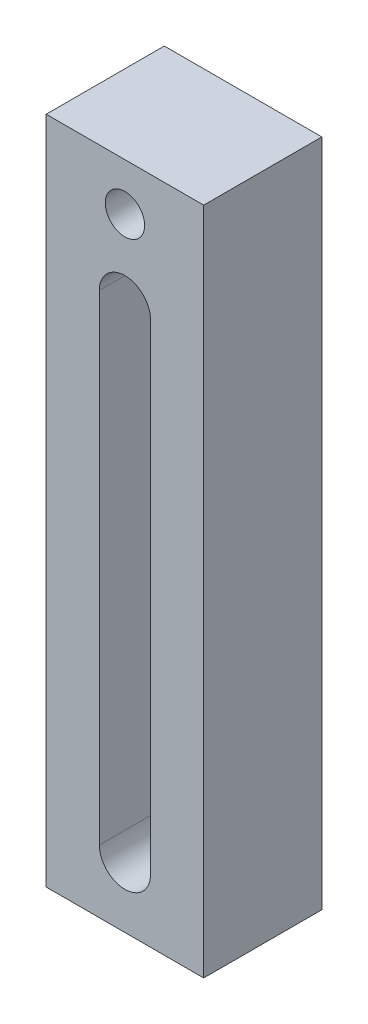
ISO-10303-21;
HEADER;
FILE_DESCRIPTION(('STEP AP214'),'2;1');
FILE_NAME('part.step','',(''),(''),'','','');
FILE_SCHEMA(('AUTOMOTIVE_DESIGN { 1 0 10303 214 1 1 1 1 }'));
ENDSEC;
DATA;
#1=APPLICATION_CONTEXT('core data for automotive mechanical design processes');
#2=APPLICATION_PROTOCOL_DEFINITION('international standard','automotive_design',2000,#1);
#3=PRODUCT_CONTEXT('',#1,'mechanical');
#4=PRODUCT('Part','Part','',(#3));
#5=PRODUCT_RELATED_PRODUCT_CATEGORY('part','',(#4));
#6=PRODUCT_DEFINITION_FORMATION('','',#4);
#7=PRODUCT_DEFINITION_CONTEXT('part definition',#1,'design');
#8=PRODUCT_DEFINITION('design','',#6,#7);
#9=PRODUCT_DEFINITION_SHAPE('','',#8);
#10=(LENGTH_UNIT() NAMED_UNIT(*) SI_UNIT(.MILLI.,.METRE.));
#11=(NAMED_UNIT(*) PLANE_ANGLE_UNIT() SI_UNIT($,.RADIAN.));
#12=(NAMED_UNIT(*) SI_UNIT($,.STERADIAN.) SOLID_ANGLE_UNIT());
#13=UNCERTAINTY_MEASURE_WITH_UNIT(LENGTH_MEASURE(1.E-05),#10,'distance_accuracy_value','');
#14=(GEOMETRIC_REPRESENTATION_CONTEXT(3) GLOBAL_UNCERTAINTY_ASSIGNED_CONTEXT((#13)) GLOBAL_UNIT_ASSIGNED_CONTEXT((#10,
#11,#12)) REPRESENTATION_CONTEXT('',''));
#15=CARTESIAN_POINT('',(0.,0.,0.));
#16=DIRECTION('',(0.,0.,1.));
#17=DIRECTION('',(1.,0.,0.));
#18=AXIS2_PLACEMENT_3D('',#15,#16,#17);
#19=CARTESIAN_POINT('',(0.,0.,15.));
#20=DIRECTION('',(1.,0.,0.));
#21=DIRECTION('',(0.,0.,-1.));
#22=AXIS2_PLACEMENT_3D('',#19,#20,#21);
#23=PLANE('',#22);
#24=DIRECTION('',(0.,-1.,0.));
#25=VECTOR('',#24,1.);
#26=CARTESIAN_POINT('',(0.,0.,0.));
#27=LINE('',#26,#25);
#28=CARTESIAN_POINT('',(0.,85.,0.));
#29=VERTEX_POINT('',#28);
#30=CARTESIAN_POINT('',(0.,0.,0.));
#31=VERTEX_POINT('',#30);
#32=EDGE_CURVE('E133',#29,#31,#27,.T.);
#33=ORIENTED_EDGE('',*,*,#32,.T.);
#34=DIRECTION('',(0.,0.,-1.));
#35=VECTOR('',#34,1.);
#36=CARTESIAN_POINT('',(0.,0.,15.));
#37=LINE('',#36,#35);
#38=CARTESIAN_POINT('',(0.,0.,15.));
#39=VERTEX_POINT('',#38);
#40=EDGE_CURVE('E11',#39,#31,#37,.T.);
#41=ORIENTED_EDGE('',*,*,#40,.F.);
#42=DIRECTION('',(0.,-1.,0.));
#43=VECTOR('',#42,1.);
#44=CARTESIAN_POINT('',(0.,0.,15.));
#45=LINE('',#44,#43);
#46=CARTESIAN_POINT('',(0.,85.,15.));
#47=VERTEX_POINT('',#46);
#48=EDGE_CURVE('E137',#47,#39,#45,.T.);
#49=ORIENTED_EDGE('',*,*,#48,.F.);
#50=DIRECTION('',(0.,0.,-1.));
#51=VECTOR('',#50,1.);
#52=CARTESIAN_POINT('',(0.,85.,15.));
#53=LINE('',#52,#51);
#54=EDGE_CURVE('E147',#47,#29,#53,.T.);
#55=ORIENTED_EDGE('',*,*,#54,.T.);
#56=EDGE_LOOP('',(#33,#41,#49,#55));
#57=FACE_BOUND('',#56,.T.);
#58=ADVANCED_FACE('F32',(#57),#23,.F.);
#59=CARTESIAN_POINT('',(0.,0.,15.));
#60=DIRECTION('',(0.,1.,0.));
#61=DIRECTION('',(0.,0.,1.));
#62=AXIS2_PLACEMENT_3D('',#59,#60,#61);
#63=PLANE('',#62);
#64=DIRECTION('',(1.,0.,0.));
#65=VECTOR('',#64,1.);
#66=CARTESIAN_POINT('',(0.,0.,0.));
#67=LINE('',#66,#65);
#68=CARTESIAN_POINT('',(20.,0.,0.));
#69=VERTEX_POINT('',#68);
#70=EDGE_CURVE('E150',#31,#69,#67,.T.);
#71=ORIENTED_EDGE('',*,*,#70,.T.);
#72=DIRECTION('',(0.,0.,-1.));
#73=VECTOR('',#72,1.);
#74=CARTESIAN_POINT('',(20.,0.,15.));
#75=LINE('',#74,#73);
#76=CARTESIAN_POINT('',(20.,0.,15.));
#77=VERTEX_POINT('',#76);
#78=EDGE_CURVE('E39',#77,#69,#75,.T.);
#79=ORIENTED_EDGE('',*,*,#78,.F.);
#80=DIRECTION('',(1.,0.,0.));
#81=VECTOR('',#80,1.);
#82=CARTESIAN_POINT('',(0.,0.,15.));
#83=LINE('',#82,#81);
#84=EDGE_CURVE('E140',#39,#77,#83,.T.);
#85=ORIENTED_EDGE('',*,*,#84,.F.);
#86=ORIENTED_EDGE('',*,*,#40,.T.);
#87=EDGE_LOOP('',(#71,#79,#85,#86));
#88=FACE_BOUND('',#87,.T.);
#89=ADVANCED_FACE('F178',(#88),#63,.F.);
#90=CARTESIAN_POINT('',(20.,0.,15.));
#91=DIRECTION('',(-1.,0.,0.));
#92=DIRECTION('',(0.,0.,1.));
#93=AXIS2_PLACEMENT_3D('',#90,#91,#92);
#94=PLANE('',#93);
#95=DIRECTION('',(0.,1.,0.));
#96=VECTOR('',#95,1.);
#97=CARTESIAN_POINT('',(20.,0.,0.));
#98=LINE('',#97,#96);
#99=CARTESIAN_POINT('',(20.,85.,0.));
#100=VERTEX_POINT('',#99);
#101=EDGE_CURVE('E152',#69,#100,#98,.T.);
#102=ORIENTED_EDGE('',*,*,#101,.T.);
#103=DIRECTION('',(0.,0.,-1.));
#104=VECTOR('',#103,1.);
#105=CARTESIAN_POINT('',(20.,85.,15.));
#106=LINE('',#105,#104);
#107=CARTESIAN_POINT('',(20.,85.,15.));
#108=VERTEX_POINT('',#107);
#109=EDGE_CURVE('E157',#108,#100,#106,.T.);
#110=ORIENTED_EDGE('',*,*,#109,.F.);
#111=DIRECTION('',(0.,1.,0.));
#112=VECTOR('',#111,1.);
#113=CARTESIAN_POINT('',(20.,0.,15.));
#114=LINE('',#113,#112);
#115=EDGE_CURVE('E143',#77,#108,#114,.T.);
#116=ORIENTED_EDGE('',*,*,#115,.F.);
#117=ORIENTED_EDGE('',*,*,#78,.T.);
#118=EDGE_LOOP('',(#102,#110,#116,#117));
#119=FACE_BOUND('',#118,.T.);
#120=ADVANCED_FACE('F164',(#119),#94,.F.);
#121=CARTESIAN_POINT('',(0.,85.,15.));
#122=DIRECTION('',(0.,-1.,0.));
#123=DIRECTION('',(0.,0.,-1.));
#124=AXIS2_PLACEMENT_3D('',#121,#122,#123);
#125=PLANE('',#124);
#126=DIRECTION('',(-1.,0.,0.));
#127=VECTOR('',#126,1.);
#128=CARTESIAN_POINT('',(0.,85.,0.));
#129=LINE('',#128,#127);
#130=EDGE_CURVE('E141',#100,#29,#129,.T.);
#131=ORIENTED_EDGE('',*,*,#130,.T.);
#132=ORIENTED_EDGE('',*,*,#54,.F.);
#133=DIRECTION('',(-1.,0.,0.));
#134=VECTOR('',#133,1.);
#135=CARTESIAN_POINT('',(0.,85.,15.));
#136=LINE('',#135,#134);
#137=EDGE_CURVE('E145',#108,#47,#136,.T.);
#138=ORIENTED_EDGE('',*,*,#137,.F.);
#139=ORIENTED_EDGE('',*,*,#109,.T.);
#140=EDGE_LOOP('',(#131,#132,#138,#139));
#141=FACE_BOUND('',#140,.T.);
#142=ADVANCED_FACE('F171',(#141),#125,.F.);
#143=CARTESIAN_POINT('',(0.,0.,15.));
#144=DIRECTION('',(0.,0.,-1.));
#145=DIRECTION('',(-1.,0.,0.));
#146=AXIS2_PLACEMENT_3D('',#143,#144,#145);
#147=PLANE('',#146);
#148=CARTESIAN_POINT('',(10.,79.,15.));
#149=DIRECTION('',(0.,0.,1.));
#150=DIRECTION('',(1.,0.,0.));
#151=AXIS2_PLACEMENT_3D('',#148,#149,#150);
#152=CIRCLE('',#151,2.5);
#153=CARTESIAN_POINT('',(12.5,79.,15.));
#154=VERTEX_POINT('',#153);
#155=EDGE_CURVE('E120',#154,#154,#152,.T.);
#156=ORIENTED_EDGE('',*,*,#155,.F.);
#157=EDGE_LOOP('',(#156));
#158=FACE_BOUND('',#157,.T.);
#159=DIRECTION('',(0.,1.,0.));
#160=VECTOR('',#159,1.);
#161=CARTESIAN_POINT('',(13.25,8.,15.));
#162=LINE('',#161,#160);
#163=CARTESIAN_POINT('',(13.25,8.,15.));
#164=VERTEX_POINT('',#163);
#165=CARTESIAN_POINT('',(13.25,69.,15.));
#166=VERTEX_POINT('',#165);
#167=EDGE_CURVE('E126',#164,#166,#162,.T.);
#168=ORIENTED_EDGE('',*,*,#167,.F.);
#169=CARTESIAN_POINT('',(10.,8.,15.));
#170=DIRECTION('',(0.,0.,1.));
#171=DIRECTION('',(1.,0.,0.));
#172=AXIS2_PLACEMENT_3D('',#169,#170,#171);
#173=CIRCLE('',#172,3.25);
#174=CARTESIAN_POINT('',(6.75,8.,15.));
#175=VERTEX_POINT('',#174);
#176=EDGE_CURVE('E46',#175,#164,#173,.T.);
#177=ORIENTED_EDGE('',*,*,#176,.F.);
#178=DIRECTION('',(0.,-1.,0.));
#179=VECTOR('',#178,1.);
#180=CARTESIAN_POINT('',(6.75,8.,15.));
#181=LINE('',#180,#179);
#182=CARTESIAN_POINT('',(6.75,69.,15.));
#183=VERTEX_POINT('',#182);
#184=EDGE_CURVE('E114',#183,#175,#181,.T.);
#185=ORIENTED_EDGE('',*,*,#184,.F.);
#186=CARTESIAN_POINT('',(10.,69.,15.));
#187=DIRECTION('',(0.,0.,1.));
#188=DIRECTION('',(1.,0.,0.));
#189=AXIS2_PLACEMENT_3D('',#186,#187,#188);
#190=CIRCLE('',#189,3.25);
#191=EDGE_CURVE('E117',#166,#183,#190,.T.);
#192=ORIENTED_EDGE('',*,*,#191,.F.);
#193=EDGE_LOOP('',(#168,#177,#185,#192));
#194=FACE_BOUND('',#193,.T.);
#195=ORIENTED_EDGE('',*,*,#48,.T.);
#196=ORIENTED_EDGE('',*,*,#84,.T.);
#197=ORIENTED_EDGE('',*,*,#115,.T.);
#198=ORIENTED_EDGE('',*,*,#137,.T.);
#199=EDGE_LOOP('',(#195,#196,#197,#198));
#200=FACE_BOUND('',#199,.T.);
#201=ADVANCED_FACE('F177',(#158,#194,#200),#147,.F.);
#202=CARTESIAN_POINT('',(0.,0.,0.));
#203=DIRECTION('',(0.,0.,-1.));
#204=DIRECTION('',(-1.,0.,0.));
#205=AXIS2_PLACEMENT_3D('',#202,#203,#204);
#206=PLANE('',#205);
#207=CARTESIAN_POINT('',(10.,79.,0.));
#208=DIRECTION('',(0.,0.,1.));
#209=DIRECTION('',(1.,0.,0.));
#210=AXIS2_PLACEMENT_3D('',#207,#208,#209);
#211=CIRCLE('',#210,2.5);
#212=CARTESIAN_POINT('',(12.5,79.,0.));
#213=VERTEX_POINT('',#212);
#214=EDGE_CURVE('E127',#213,#213,#211,.T.);
#215=ORIENTED_EDGE('',*,*,#214,.T.);
#216=EDGE_LOOP('',(#215));
#217=FACE_BOUND('',#216,.T.);
#218=CARTESIAN_POINT('',(10.,8.,0.));
#219=DIRECTION('',(0.,0.,1.));
#220=DIRECTION('',(1.,0.,0.));
#221=AXIS2_PLACEMENT_3D('',#218,#219,#220);
#222=CIRCLE('',#221,3.25);
#223=CARTESIAN_POINT('',(6.75,8.,0.));
#224=VERTEX_POINT('',#223);
#225=CARTESIAN_POINT('',(13.25,8.,0.));
#226=VERTEX_POINT('',#225);
#227=EDGE_CURVE('E98',#224,#226,#222,.T.);
#228=ORIENTED_EDGE('',*,*,#227,.T.);
#229=DIRECTION('',(0.,1.,0.));
#230=VECTOR('',#229,1.);
#231=CARTESIAN_POINT('',(13.25,8.,0.));
#232=LINE('',#231,#230);
#233=CARTESIAN_POINT('',(13.25,69.,0.));
#234=VERTEX_POINT('',#233);
#235=EDGE_CURVE('E107',#226,#234,#232,.T.);
#236=ORIENTED_EDGE('',*,*,#235,.T.);
#237=CARTESIAN_POINT('',(10.,69.,0.));
#238=DIRECTION('',(0.,0.,1.));
#239=DIRECTION('',(1.,0.,0.));
#240=AXIS2_PLACEMENT_3D('',#237,#238,#239);
#241=CIRCLE('',#240,3.25);
#242=CARTESIAN_POINT('',(6.75,69.,0.));
#243=VERTEX_POINT('',#242);
#244=EDGE_CURVE('E54',#234,#243,#241,.T.);
#245=ORIENTED_EDGE('',*,*,#244,.T.);
#246=DIRECTION('',(0.,-1.,0.));
#247=VECTOR('',#246,1.);
#248=CARTESIAN_POINT('',(6.75,8.,0.));
#249=LINE('',#248,#247);
#250=EDGE_CURVE('E104',#243,#224,#249,.T.);
#251=ORIENTED_EDGE('',*,*,#250,.T.);
#252=EDGE_LOOP('',(#228,#236,#245,#251));
#253=FACE_BOUND('',#252,.T.);
#254=ORIENTED_EDGE('',*,*,#32,.F.);
#255=ORIENTED_EDGE('',*,*,#130,.F.);
#256=ORIENTED_EDGE('',*,*,#101,.F.);
#257=ORIENTED_EDGE('',*,*,#70,.F.);
#258=EDGE_LOOP('',(#254,#255,#256,#257));
#259=FACE_BOUND('',#258,.T.);
#260=ADVANCED_FACE('F111',(#217,#253,#259),#206,.T.);
#261=CARTESIAN_POINT('',(10.,8.,0.));
#262=DIRECTION('',(0.,0.,1.));
#263=DIRECTION('',(1.,0.,0.));
#264=AXIS2_PLACEMENT_3D('',#261,#262,#263);
#265=CYLINDRICAL_SURFACE('',#264,3.25);
#266=ORIENTED_EDGE('',*,*,#176,.T.);
#267=DIRECTION('',(0.,0.,1.));
#268=VECTOR('',#267,1.);
#269=CARTESIAN_POINT('',(13.25,8.,0.));
#270=LINE('',#269,#268);
#271=EDGE_CURVE('E94',#226,#164,#270,.T.);
#272=ORIENTED_EDGE('',*,*,#271,.F.);
#273=ORIENTED_EDGE('',*,*,#227,.F.);
#274=DIRECTION('',(0.,0.,1.));
#275=VECTOR('',#274,1.);
#276=CARTESIAN_POINT('',(6.75,8.,0.));
#277=LINE('',#276,#275);
#278=EDGE_CURVE('E131',#224,#175,#277,.T.);
#279=ORIENTED_EDGE('',*,*,#278,.T.);
#280=EDGE_LOOP('',(#266,#272,#273,#279));
#281=FACE_BOUND('',#280,.T.);
#282=ADVANCED_FACE('F96',(#281),#265,.F.);
#283=CARTESIAN_POINT('',(6.75,8.,0.));
#284=DIRECTION('',(-1.,0.,0.));
#285=DIRECTION('',(0.,0.,1.));
#286=AXIS2_PLACEMENT_3D('',#283,#284,#285);
#287=PLANE('',#286);
#288=ORIENTED_EDGE('',*,*,#184,.T.);
#289=ORIENTED_EDGE('',*,*,#278,.F.);
#290=ORIENTED_EDGE('',*,*,#250,.F.);
#291=DIRECTION('',(0.,0.,1.));
#292=VECTOR('',#291,1.);
#293=CARTESIAN_POINT('',(6.75,69.,0.));
#294=LINE('',#293,#292);
#295=EDGE_CURVE('E134',#243,#183,#294,.T.);
#296=ORIENTED_EDGE('',*,*,#295,.T.);
#297=EDGE_LOOP('',(#288,#289,#290,#296));
#298=FACE_BOUND('',#297,.T.);
#299=ADVANCED_FACE('F196',(#298),#287,.F.);
#300=CARTESIAN_POINT('',(10.,69.,0.));
#301=DIRECTION('',(0.,0.,1.));
#302=DIRECTION('',(1.,0.,0.));
#303=AXIS2_PLACEMENT_3D('',#300,#301,#302);
#304=CYLINDRICAL_SURFACE('',#303,3.25);
#305=ORIENTED_EDGE('',*,*,#191,.T.);
#306=ORIENTED_EDGE('',*,*,#295,.F.);
#307=ORIENTED_EDGE('',*,*,#244,.F.);
#308=DIRECTION('',(0.,0.,1.));
#309=VECTOR('',#308,1.);
#310=CARTESIAN_POINT('',(13.25,69.,0.));
#311=LINE('',#310,#309);
#312=EDGE_CURVE('E103',#234,#166,#311,.T.);
#313=ORIENTED_EDGE('',*,*,#312,.T.);
#314=EDGE_LOOP('',(#305,#306,#307,#313));
#315=FACE_BOUND('',#314,.T.);
#316=ADVANCED_FACE('F200',(#315),#304,.F.);
#317=CARTESIAN_POINT('',(13.25,8.,0.));
#318=DIRECTION('',(1.,0.,0.));
#319=DIRECTION('',(0.,0.,-1.));
#320=AXIS2_PLACEMENT_3D('',#317,#318,#319);
#321=PLANE('',#320);
#322=ORIENTED_EDGE('',*,*,#167,.T.);
#323=ORIENTED_EDGE('',*,*,#312,.F.);
#324=ORIENTED_EDGE('',*,*,#235,.F.);
#325=ORIENTED_EDGE('',*,*,#271,.T.);
#326=EDGE_LOOP('',(#322,#323,#324,#325));
#327=FACE_BOUND('',#326,.T.);
#328=ADVANCED_FACE('F108',(#327),#321,.F.);
#329=CARTESIAN_POINT('',(10.,79.,0.));
#330=DIRECTION('',(0.,0.,1.));
#331=DIRECTION('',(1.,0.,0.));
#332=AXIS2_PLACEMENT_3D('',#329,#330,#331);
#333=CYLINDRICAL_SURFACE('',#332,2.5);
#334=ORIENTED_EDGE('',*,*,#214,.F.);
#335=EDGE_LOOP('',(#334));
#336=FACE_BOUND('',#335,.T.);
#337=ORIENTED_EDGE('',*,*,#155,.T.);
#338=EDGE_LOOP('',(#337));
#339=FACE_BOUND('',#338,.T.);
#340=ADVANCED_FACE('F199',(#336,#339),#333,.F.);
#341=CLOSED_SHELL('',(#58,#89,#120,#142,#201,#260,#282,#299,#316,#328,#340));
#342=MANIFOLD_SOLID_BREP('B2',#341);
#343=ADVANCED_BREP_SHAPE_REPRESENTATION('',(#18,#342),#14);
#344=SHAPE_DEFINITION_REPRESENTATION(#9,#343);
ENDSEC;
END-ISO-10303-21;
